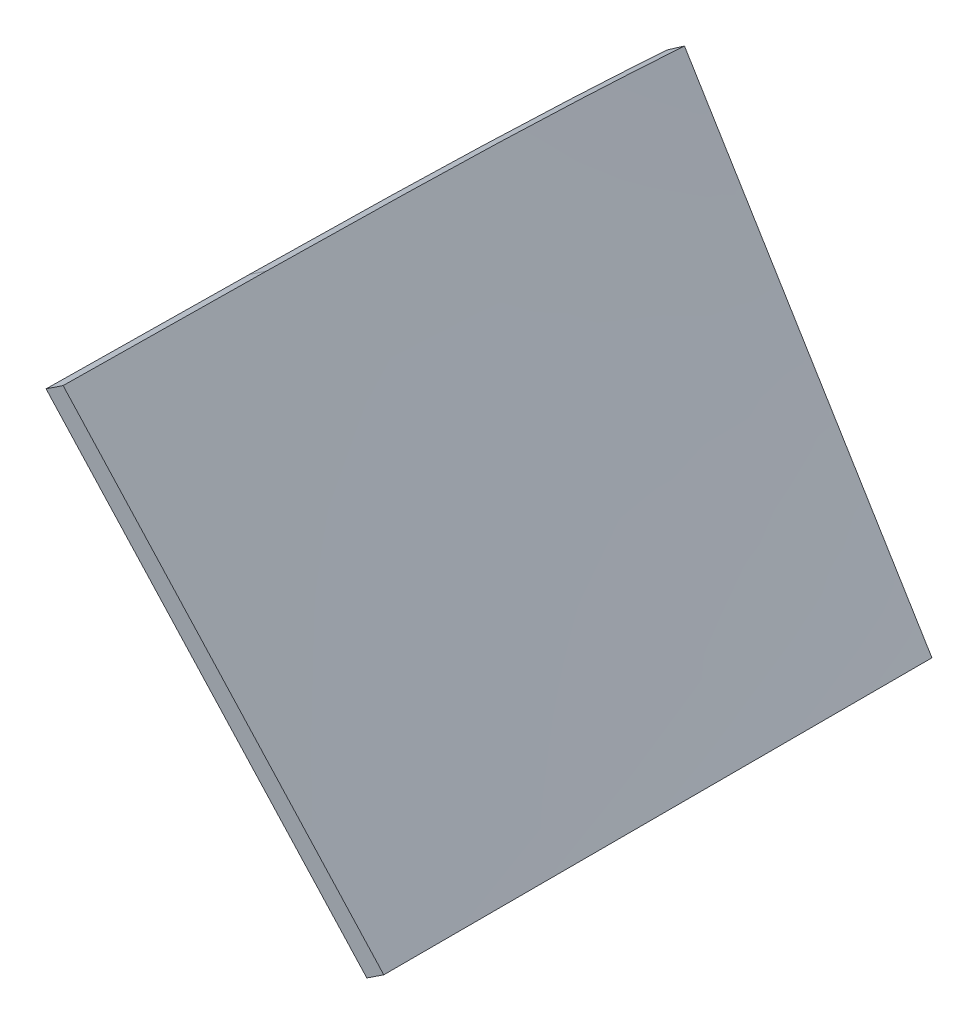
ISO-10303-21;
HEADER;
FILE_DESCRIPTION(('STEP AP214'),'2;1');
FILE_NAME('part.step','',(''),(''),'','','');
FILE_SCHEMA(('AUTOMOTIVE_DESIGN { 1 0 10303 214 1 1 1 1 }'));
ENDSEC;
DATA;
#1=APPLICATION_CONTEXT('core data for automotive mechanical design processes');
#2=APPLICATION_PROTOCOL_DEFINITION('international standard','automotive_design',2000,#1);
#3=PRODUCT_CONTEXT('',#1,'mechanical');
#4=PRODUCT('Part','Part','',(#3));
#5=PRODUCT_RELATED_PRODUCT_CATEGORY('part','',(#4));
#6=PRODUCT_DEFINITION_FORMATION('','',#4);
#7=PRODUCT_DEFINITION_CONTEXT('part definition',#1,'design');
#8=PRODUCT_DEFINITION('design','',#6,#7);
#9=PRODUCT_DEFINITION_SHAPE('','',#8);
#10=(LENGTH_UNIT() NAMED_UNIT(*) SI_UNIT(.MILLI.,.METRE.));
#11=(NAMED_UNIT(*) PLANE_ANGLE_UNIT() SI_UNIT($,.RADIAN.));
#12=(NAMED_UNIT(*) SI_UNIT($,.STERADIAN.) SOLID_ANGLE_UNIT());
#13=UNCERTAINTY_MEASURE_WITH_UNIT(LENGTH_MEASURE(1.E-05),#10,'distance_accuracy_value','');
#14=(GEOMETRIC_REPRESENTATION_CONTEXT(3) GLOBAL_UNCERTAINTY_ASSIGNED_CONTEXT((#13)) GLOBAL_UNIT_ASSIGNED_CONTEXT((#10,
#11,#12)) REPRESENTATION_CONTEXT('',''));
#15=CARTESIAN_POINT('',(0.,0.,0.));
#16=DIRECTION('',(0.,0.,1.));
#17=DIRECTION('',(1.,0.,0.));
#18=AXIS2_PLACEMENT_3D('',#15,#16,#17);
#19=CARTESIAN_POINT('',(-46.35271634638,40.53830935055,-44.7571495075));
#20=CARTESIAN_POINT('',(-41.96847746689,33.91507124039,-45.63504093705));
#21=CARTESIAN_POINT('',(-37.58423858741,27.29183313022,-46.5129323666));
#22=CARTESIAN_POINT('',(-33.19999970793,20.66859502006,-47.39082379616));
#23=CARTESIAN_POINT('',(-46.35271634575,40.53826691896,-44.76125233309));
#24=CARTESIAN_POINT('',(-41.96847746647,33.91504295266,-45.63889229337));
#25=CARTESIAN_POINT('',(-37.5842385872,27.29181898636,-46.51653225364));
#26=CARTESIAN_POINT('',(-33.19999970793,20.66859502006,-47.39417221391));
#27=CARTESIAN_POINT('',(-46.352715919,40.50971322981,-47.52195909475));
#28=CARTESIAN_POINT('',(-41.96847718226,33.89600716012,-48.23045546666));
#29=CARTESIAN_POINT('',(-37.58423844551,27.28230109043,-48.93895183858));
#30=CARTESIAN_POINT('',(-33.19999970877,20.66859502074,-49.64744821049));
#31=CARTESIAN_POINT('',(-46.35271621191,40.45281096228,-52.71864836174));
#32=CARTESIAN_POINT('',(-41.96847737712,33.85807231626,-53.19598283703));
#33=CARTESIAN_POINT('',(-37.58423854233,27.26333367024,-53.67331731233));
#34=CARTESIAN_POINT('',(-33.19999970754,20.66859502422,-54.15065178762));
#35=CARTESIAN_POINT('',(-46.3527145409,40.36959181985,-60.02635308157));
#36=CARTESIAN_POINT('',(-41.96847626328,33.80259288914,-60.31771356261));
#37=CARTESIAN_POINT('',(-37.58423798565,27.23559395843,-60.60907404365));
#38=CARTESIAN_POINT('',(-33.19999970803,20.66859502772,-60.90043452468));
#39=CARTESIAN_POINT('',(-46.35271084699,40.22175439641,-67.33566899911));
#40=CARTESIAN_POINT('',(-41.96847380062,33.70403460815,-67.44051798495));
#41=CARTESIAN_POINT('',(-37.58423675425,27.1863148199,-67.54536697079));
#42=CARTESIAN_POINT('',(-33.19999970789,20.66859503164,-67.65021595662));
#43=CARTESIAN_POINT('',(-46.35271116344,40.01548672161,-72.5251121711));
#44=CARTESIAN_POINT('',(-41.9684740116,33.56652282577,-72.40009805059));
#45=CARTESIAN_POINT('',(-37.58423685976,27.11755892992,-72.27508393008));
#46=CARTESIAN_POINT('',(-33.19999970792,20.66859503408,-72.15006980957));
#47=CARTESIAN_POINT('',(-46.35270771597,39.85315514337,-75.27684291461));
#48=CARTESIAN_POINT('',(-41.96847171328,33.458301774,-74.98456063754));
#49=CARTESIAN_POINT('',(-37.5842357106,27.06344840463,-74.69227836047));
#50=CARTESIAN_POINT('',(-33.19999970792,20.66859503525,-74.3999960834));
#51=B_SPLINE_SURFACE_WITH_KNOTS('',3,3,((#19,#20,#21,#22),(#23,#24,#25,#26),(#27,#28,#29,#30),
(#31,#32,#33,#34),(#35,#36,#37,#38),(#39,#40,#41,#42),(#43,#44,#45,#46),(#47,#48,#49,#50)),
.UNSPECIFIED.,.F.,.F.,.F.,(4,1,1,1,1,4),(4,4),(0.,0.0003719200707526,0.2502789763063,
0.5001860325419,0.7500930887774,1.),(0.02018564689678,0.9798143531073),.UNSPECIFIED.);
#52=DIRECTION('',(-0.565056265352985,0.824191961433354,-0.0376699839922836));
#53=VECTOR('',#52,1.);
#54=CARTESIAN_POINT('',(-39.745382843612,30.2157012175643,-74.8363499357355));
#55=LINE('',#54,#53);
#56=CARTESIAN_POINT('',(-33.1999997104452,20.6685950377552,-74.3999960838583));
#57=VERTEX_POINT('',#56);
#58=CARTESIAN_POINT('',(-46.2907657170478,39.7628069950391,-75.2727041596154));
#59=VERTEX_POINT('',#58);
#60=EDGE_CURVE('E142',#57,#59,#55,.T.);
#61=DIRECTION('',(7.08540403902029E-11,-5.6613843154E-10,1.));
#62=VECTOR('',#61,1.);
#63=CARTESIAN_POINT('',(-33.1999997079825,20.6685950276737,-60.764996397554));
#64=LINE('',#63,#62);
#65=CARTESIAN_POINT('',(-33.1999997093079,20.6685950228401,-47.3999975347496));
#66=VERTEX_POINT('',#65);
#67=EDGE_CURVE('E78',#57,#66,#64,.T.);
#68=CARTESIAN_POINT('',(-33.199999709662,20.668595022675,-47.3999975349335));
#69=CARTESIAN_POINT('',(-33.6003749246506,21.2734354423088,-47.3195482575815));
#70=CARTESIAN_POINT('',(-34.0007499598166,21.8782759808334,-47.2390989791535));
#71=CARTESIAN_POINT('',(-36.0026242813803,24.9024792384408,-46.8368525832584));
#72=CARTESIAN_POINT('',(-37.6041210049781,27.321843652474,-46.5150554545268));
#73=CARTESIAN_POINT('',(-40.3968011965886,31.5407247044943,-45.9539068482158));
#74=CARTESIAN_POINT('',(-41.5879856294462,33.3402407032827,-45.7145553667118));
#75=CARTESIAN_POINT('',(-43.9703524428452,36.9392740617689,-45.2358524216187));
#76=CARTESIAN_POINT('',(-45.1615348233867,38.7387914214669,-44.9965009580297));
#77=CARTESIAN_POINT('',(-46.3527163463802,40.5383093505504,-44.7571495074963));
#78=B_SPLINE_CURVE_WITH_KNOTS('',3,(#68,#69,#70,#71,#72,#73,#74,#75,#76,#77),.UNSPECIFIED.,.F.,
.F.,(4,2,2,2,4),(0.,2.18939237918589,10.9469618959338,17.4608091333248,23.9746563707246),.UNSPECIFIED.);
#79=CARTESIAN_POINT('',(-46.3527163463802,40.5383093505503,-44.7571495074993));
#80=VERTEX_POINT('',#79);
#81=EDGE_CURVE('E24',#66,#80,#78,.T.);
#82=CARTESIAN_POINT('',(-46.3452307460418,40.4178369783347,-54.7631379299025));
#83=CARTESIAN_POINT('',(-46.3456211186446,40.4226660094234,-54.3976782527337));
#84=CARTESIAN_POINT('',(-46.3460803433269,40.4275254063649,-54.0322190246597));
#85=CARTESIAN_POINT('',(-46.3469826606872,40.4371366392343,-53.3012996938548));
#86=CARTESIAN_POINT('',(-46.3474257533896,40.4418884753243,-52.9358395911259));
#87=CARTESIAN_POINT('',(-46.3481028616479,40.4506123986608,-52.2448297037328));
#88=CARTESIAN_POINT('',(-46.3483544264335,40.4546129665785,-51.9192803060328));
#89=CARTESIAN_POINT('',(-46.3486152959292,40.4622263897717,-51.2681768384454));
#90=CARTESIAN_POINT('',(-46.3486246006052,40.4658392449926,-50.9426227685574));
#91=CARTESIAN_POINT('',(-46.3485322056496,40.4728708630132,-50.2915124309111));
#92=CARTESIAN_POINT('',(-46.3484305059474,40.4762896256896,-49.9659561631516));
#93=CARTESIAN_POINT('',(-46.3482794251874,40.4831748680905,-49.3148442390717));
#94=CARTESIAN_POINT('',(-46.3482300441039,40.4866413477916,-48.989288582751));
#95=CARTESIAN_POINT('',(-46.3483734448369,40.4939048517459,-48.3381816649125));
#96=CARTESIAN_POINT('',(-46.3485662260943,40.4977018752359,-48.0126304033864));
#97=CARTESIAN_POINT('',(-46.3492201437808,40.5056635283119,-47.3615324782065));
#98=CARTESIAN_POINT('',(-46.3496812804235,40.5098281581906,-47.0359858145567));
#99=CARTESIAN_POINT('',(-46.3506557203851,40.5181970183352,-46.3848926985881));
#100=CARTESIAN_POINT('',(-46.3511690237671,40.522401248649,-46.0593462462701));
#101=CARTESIAN_POINT('',(-46.3520756782891,40.530587452471,-45.4082507730209));
#102=CARTESIAN_POINT('',(-46.3524690295589,40.5345694262199,-45.0827017520929));
#103=CARTESIAN_POINT('',(-46.3527163463802,40.5383093505503,-44.7571495075005));
#104=B_SPLINE_CURVE_WITH_KNOTS('',3,(#82,#83,#84,#85,#86,#87,#88,#89,#90,#91,#92,#93,#94,#95,
#96,#97,#98,#99,#100,#101,#102,#103),.UNSPECIFIED.,.F.,.F.,(4,2,2,2,2,2,2,2,2,2,4),(0.,
1.09647541821,2.19294918582856,3.16967116265738,4.14639327719797,5.12311601283067,
6.09983826776969,7.07655826760094,8.05327904493057,9.03000100417975,10.0067219060724),.UNSPECIFIED.);
#105=CARTESIAN_POINT('',(-46.34523074604,40.4178369783357,-54.7631379299026));
#106=VERTEX_POINT('',#105);
#107=EDGE_CURVE('E76',#106,#80,#104,.T.);
#108=CARTESIAN_POINT('',(-46.3452307460382,40.4178369783366,-54.7631379299026));
#109=CARTESIAN_POINT('',(-46.344871233383,40.4133740753418,-55.1010341326133));
#110=CARTESIAN_POINT('',(-46.3444817378596,40.4088004295629,-55.4389286441747));
#111=CARTESIAN_POINT('',(-46.3436481114375,40.3993879392983,-56.1147168428921));
#112=CARTESIAN_POINT('',(-46.3432039800633,40.394549092504,-56.4526105300154));
#113=CARTESIAN_POINT('',(-46.3408600412703,40.3695823912351,-58.1420941800658));
#114=CARTESIAN_POINT('',(-46.3385904796578,40.3471381757722,-59.4936530165683));
#115=CARTESIAN_POINT('',(-46.3348028399024,40.307283515031,-61.5208661729308));
#116=CARTESIAN_POINT('',(-46.3334764139609,40.2929672790461,-62.1965814695101));
#117=CARTESIAN_POINT('',(-46.3306902801319,40.2616344995744,-63.5479487885036));
#118=CARTESIAN_POINT('',(-46.3292305725384,40.2446179620436,-64.223600811054));
#119=CARTESIAN_POINT('',(-46.326024840861,40.2071375957596,-65.5748144323061));
#120=CARTESIAN_POINT('',(-46.3242788147672,40.1866737428078,-66.2503760303398));
#121=CARTESIAN_POINT('',(-46.3203277213981,40.1416754849692,-67.6013599954687));
#122=CARTESIAN_POINT('',(-46.3181226566496,40.117141102489,-68.27678236331));
#123=CARTESIAN_POINT('',(-46.3139476236654,40.0693739290101,-69.4791209607694));
#124=CARTESIAN_POINT('',(-46.3120323875596,40.0470387417904,-70.0060730321886));
#125=CARTESIAN_POINT('',(-46.3080859527196,39.9992724723857,-71.0598362730649));
#126=CARTESIAN_POINT('',(-46.3060547541459,39.9738413944909,-71.5866474427163));
#127=CARTESIAN_POINT('',(-46.3019018044209,39.9196267339011,-72.6401249516446));
#128=CARTESIAN_POINT('',(-46.2997800486051,39.8908429783809,-73.1667912820513));
#129=CARTESIAN_POINT('',(-46.2953934003465,39.8296312513973,-74.2199155046445));
#130=CARTESIAN_POINT('',(-46.2931285067346,39.7972032501622,-74.7463733950929));
#131=CARTESIAN_POINT('',(-46.2907657200124,39.7628069759444,-75.2727045490151));
#132=B_SPLINE_CURVE_WITH_KNOTS('',3,(#108,#109,#110,#111,#112,#113,#114,#115,#116,#117,#118,
#119,#120,#121,#122,#123,#124,#125,#126,#127,#128,#129,#130,#131),.UNSPECIFIED.,.F.,.F.,(4,2,2,
2,2,2,2,2,2,2,2,4),(0.,1.01377716603322,2.02756315808245,6.08278390316728,8.11038483788249,
10.1379813004965,12.1655919965462,14.1931915317764,15.7754695859303,17.3577454474947,
18.9401029090329,20.5224732986545),.UNSPECIFIED.);
#133=EDGE_CURVE('E87',#106,#59,#132,.T.);
#134=ORIENTED_EDGE('',*,*,#60,.F.);
#135=ORIENTED_EDGE('',*,*,#67,.T.);
#136=ORIENTED_EDGE('',*,*,#81,.T.);
#137=ORIENTED_EDGE('',*,*,#107,.F.);
#138=ORIENTED_EDGE('',*,*,#133,.T.);
#139=EDGE_LOOP('',(#134,#135,#136,#137,#138));
#140=FACE_BOUND('',#139,.T.);
#141=ADVANCED_FACE('F17',(#140),#51,.T.);
#142=CARTESIAN_POINT('',(-33.23903367021,20.64180625069,-74.66999523081));
#143=CARTESIAN_POINT('',(-32.93817576224,20.84828331048,-74.6699952307));
#144=CARTESIAN_POINT('',(-32.63731785428,21.05476037027,-74.66999523059));
#145=CARTESIAN_POINT('',(-32.33645994632,21.26123743007,-74.66999523049));
#146=CARTESIAN_POINT('',(-33.23903801549,20.64181258561,-74.57999551502));
#147=CARTESIAN_POINT('',(-32.93814661582,20.84824081802,-74.57999551491));
#148=CARTESIAN_POINT('',(-32.63725521615,21.05466905043,-74.5799955148));
#149=CARTESIAN_POINT('',(-32.33636381648,21.26109728285,-74.57999551469));
#150=CARTESIAN_POINT('',(-33.23925662179,20.64213136522,-69.98846708468));
#151=CARTESIAN_POINT('',(-32.93668029367,20.84610255409,-69.98846708457));
#152=CARTESIAN_POINT('',(-32.63410396555,21.05007374295,-69.98846708445));
#153=CARTESIAN_POINT('',(-32.33152763743,21.25404493182,-69.98846708434));
#154=CARTESIAN_POINT('',(-33.23938394824,20.64232473057,-60.89846785283));
#155=CARTESIAN_POINT('',(-32.93582623967,20.8448054986,-60.89846785272));
#156=CARTESIAN_POINT('',(-32.6322685311,21.04728626662,-60.8984678526));
#157=CARTESIAN_POINT('',(-32.32871082254,21.24976703465,-60.89846785249));
#158=CARTESIAN_POINT('',(-33.23944319341,20.64241286389,-51.71846834647));
#159=CARTESIAN_POINT('',(-32.93542884726,20.84421429629,-51.71846834635));
#160=CARTESIAN_POINT('',(-32.63141450112,21.0460157287,-51.71846834624));
#161=CARTESIAN_POINT('',(-32.32740015497,21.2478171611,-51.71846834612));
#162=CARTESIAN_POINT('',(-33.23947930787,20.64246744659,-47.03999755465));
#163=CARTESIAN_POINT('',(-32.9351866061,20.84384815748,-47.03999755453));
#164=CARTESIAN_POINT('',(-32.63089390433,21.04522886837,-47.03999755441));
#165=CARTESIAN_POINT('',(-32.32660120255,21.24660957926,-47.0399975543));
#166=CARTESIAN_POINT('',(-33.23948070755,20.64246956317,-46.85999756432));
#167=CARTESIAN_POINT('',(-32.93517721765,20.84383395952,-46.85999756421));
#168=CARTESIAN_POINT('',(-32.63087372775,21.04519835586,-46.85999756409));
#169=CARTESIAN_POINT('',(-32.32657023786,21.24656275221,-46.85999756398));
#170=B_SPLINE_SURFACE_WITH_KNOTS('',3,3,((#142,#143,#144,#145),(#146,#147,#148,#149),(#150,#151,
#152,#153),(#154,#155,#156,#157),(#158,#159,#160,#161),(#162,#163,#164,#165),(#166,#167,#168,
#169)),.UNSPECIFIED.,.F.,.F.,.F.,(4,1,1,1,4),(4,4),(1.735119587939E-08,0.009708725203181,
0.4953105606028,0.9805825240236,1.),(0.2234595600417,0.7765404393365),.UNSPECIFIED.);
#171=CARTESIAN_POINT('',(-32.3752272450634,21.2340492941419,-74.3999921229055));
#172=CARTESIAN_POINT('',(-32.3745023857276,21.2329934731899,-73.6701804038076));
#173=CARTESIAN_POINT('',(-32.3738604410586,21.2320562375851,-72.9403684729336));
#174=CARTESIAN_POINT('',(-32.3710049293247,21.2278775655191,-69.29130762419));
#175=CARTESIAN_POINT('',(-32.3698539981946,21.2261586485365,-66.3720561816685));
#176=CARTESIAN_POINT('',(-32.3687018681136,21.2244258482934,-62.1150709147366));
#177=CARTESIAN_POINT('',(-32.3684155924907,21.2239927539255,-60.777337020121));
#178=CARTESIAN_POINT('',(-32.3678865486693,21.2231953132975,-58.1018691994578));
#179=CARTESIAN_POINT('',(-32.3676437804696,21.2228309670356,-56.76413527341));
#180=CARTESIAN_POINT('',(-32.367190432851,21.2221508227852,-54.0886673793632));
#181=CARTESIAN_POINT('',(-32.366979853433,21.2218350247979,-52.7509334113641));
#182=CARTESIAN_POINT('',(-32.3665632001926,21.2212091209169,-50.0754654731639));
#183=CARTESIAN_POINT('',(-32.3663571263703,21.2208990150232,-48.7377315029627));
#184=CARTESIAN_POINT('',(-32.3661394637497,21.2205703270809,-47.3999975343849));
#185=B_SPLINE_CURVE_WITH_KNOTS('',3,(#171,#172,#173,#174,#175,#176,#177,#178,#179,#180,#181,
#182,#183,#184),.UNSPECIFIED.,.F.,.F.,(4,2,2,2,2,2,4),(0.,2.18943843421587,10.9471932295487,
14.9603953058982,18.9735972724603,22.986799342661,27.0000014132302),.UNSPECIFIED.);
#186=CARTESIAN_POINT('',(-32.3752256158428,21.2340504148553,-74.3999921228046));
#187=VERTEX_POINT('',#186);
#188=CARTESIAN_POINT('',(-32.3661375940465,21.2205706313074,-47.3999976210563));
#189=VERTEX_POINT('',#188);
#190=EDGE_CURVE('E174',#187,#189,#185,.T.);
#191=DIRECTION('',(-0.833860391670287,-0.551975404527661,-3.14866209467276E-10));
#192=VECTOR('',#191,1.);
#193=CARTESIAN_POINT('',(-32.7830649410598,20.9445857559192,-47.3999975344082));
#194=LINE('',#193,#192);
#195=EDGE_CURVE('E80',#189,#66,#194,.T.);
#196=DIRECTION('',(-0.82477735618273,-0.565457613541933,-3.96071078914936E-06));
#197=VECTOR('',#196,1.);
#198=CARTESIAN_POINT('',(-32.7876110333804,20.9513238472209,-74.3999941032725));
#199=LINE('',#198,#197);
#200=EDGE_CURVE('E195',#187,#57,#199,.T.);
#201=ORIENTED_EDGE('',*,*,#190,.T.);
#202=ORIENTED_EDGE('',*,*,#195,.T.);
#203=ORIENTED_EDGE('',*,*,#67,.F.);
#204=ORIENTED_EDGE('',*,*,#200,.F.);
#205=EDGE_LOOP('',(#201,#202,#203,#204));
#206=FACE_BOUND('',#205,.T.);
#207=ADVANCED_FACE('F153',(#206),#170,.F.);
#208=CARTESIAN_POINT('',(-33.10794960236,20.44376641107,-47.42642933321));
#209=CARTESIAN_POINT('',(-32.80367345161,20.64517918743,-47.42640375571));
#210=CARTESIAN_POINT('',(-32.49939730085,20.84659196379,-47.42637817822));
#211=CARTESIAN_POINT('',(-32.1951211501,21.04800474014,-47.42635260072));
#212=CARTESIAN_POINT('',(-33.15179191387,20.50999869409,-47.41761873154));
#213=CARTESIAN_POINT('',(-32.84751634873,20.71141221127,-47.41760169802));
#214=CARTESIAN_POINT('',(-32.54324078359,20.91282572845,-47.41758466451));
#215=CARTESIAN_POINT('',(-32.23896521845,21.11423924563,-47.41756763099));
#216=CARTESIAN_POINT('',(-34.65704466184,22.78397381843,-47.11512148001));
#217=CARTESIAN_POINT('',(-34.35278913159,22.98541270538,-47.11539716458));
#218=CARTESIAN_POINT('',(-34.04853360134,23.18685159234,-47.11567284915));
#219=CARTESIAN_POINT('',(-33.74427807109,23.38829047929,-47.11594853372));
#220=CARTESIAN_POINT('',(-37.62370846316,27.26569234714,-46.51894304225));
#221=CARTESIAN_POINT('',(-37.31948766216,27.46717689308,-46.5197535072));
#222=CARTESIAN_POINT('',(-37.01526686115,27.66866143902,-46.52056397216));
#223=CARTESIAN_POINT('',(-36.71104606015,27.87014598496,-46.52137443711));
#224=CARTESIAN_POINT('',(-42.00794175747,33.88892243997,-45.63790476808));
#225=CARTESIAN_POINT('',(-41.70376400501,34.09046878067,-45.63940068829));
#226=CARTESIAN_POINT('',(-41.39958625256,34.29201512138,-45.64089660851));
#227=CARTESIAN_POINT('',(-41.09540850011,34.49356146208,-45.64239252872));
#228=CARTESIAN_POINT('',(-44.97460685344,38.37064179563,-45.04174306465));
#229=CARTESIAN_POINT('',(-44.67045385719,38.57222743004,-45.04364478136));
#230=CARTESIAN_POINT('',(-44.36630086094,38.77381306446,-45.04554649807));
#231=CARTESIAN_POINT('',(-44.06214786469,38.97539869887,-45.04744821478));
#232=CARTESIAN_POINT('',(-46.47986078531,40.64461781985,-44.73925854721));
#233=CARTESIAN_POINT('',(-46.17571870445,40.84622189659,-44.74135483063));
#234=CARTESIAN_POINT('',(-45.87157662358,41.04782597334,-44.74345111404));
#235=CARTESIAN_POINT('',(-45.56743454271,41.24943005008,-44.74554739746));
#236=CARTESIAN_POINT('',(-46.52370313247,40.71085013056,-44.7304483199));
#237=CARTESIAN_POINT('',(-46.21956136812,40.91245474317,-44.73255026079));
#238=CARTESIAN_POINT('',(-45.91541960376,41.11405935578,-44.73465220168));
#239=CARTESIAN_POINT('',(-45.61127783941,41.31566396839,-44.73675414258));
#240=B_SPLINE_SURFACE_WITH_KNOTS('',3,3,((#208,#209,#210,#211),(#212,#213,#214,#215),(#216,#217,
#218,#219),(#220,#221,#222,#223),(#224,#225,#226,#227),(#228,#229,#230,#231),(#232,#233,#234,
#235),(#236,#237,#238,#239)),.UNSPECIFIED.,.F.,.F.,.F.,(4,1,1,1,1,4),(4,4),(0.0002070625314201,
0.0100069237743,0.336668974936,0.6633310260977,0.9899930772594,0.9997929386667),
(0.2234595601778,0.7765459834163),.UNSPECIFIED.);
#241=CARTESIAN_POINT('',(-32.3661386009627,21.2205690236845,-47.3999977078618));
#242=CARTESIAN_POINT('',(-32.766527257408,21.8254288263303,-47.3197613372516));
#243=CARTESIAN_POINT('',(-33.1669154978843,22.430288350753,-47.2395207934667));
#244=CARTESIAN_POINT('',(-35.1688546874308,25.4545846465211,-46.8382980277578));
#245=CARTESIAN_POINT('',(-36.7703995970201,27.8740174373554,-46.5172556656763));
#246=CARTESIAN_POINT('',(-39.5631575983197,32.0930089016989,-45.9573296712542));
#247=CARTESIAN_POINT('',(-40.7543731868123,33.8925691045453,-45.7184700143844));
#248=CARTESIAN_POINT('',(-43.1367989855807,37.4916865069768,-45.2407012462712));
#249=CARTESIAN_POINT('',(-44.3280091958564,39.2912437065618,-45.0017921350278));
#250=CARTESIAN_POINT('',(-45.5192171190151,41.0907997956548,-44.7628632584012));
#251=B_SPLINE_CURVE_WITH_KNOTS('',3,(#241,#242,#243,#244,#245,#246,#247,#248,#249,#250),
.UNSPECIFIED.,.F.,.F.,(4,2,2,2,4),(0.,2.18939237922101,10.946961897884,17.4608078380244,
23.9746537818239),.UNSPECIFIED.);
#252=CARTESIAN_POINT('',(-45.5192170215973,41.0907998602196,-44.7628632590621));
#253=VERTEX_POINT('',#252);
#254=EDGE_CURVE('E91',#189,#253,#251,.T.);
#255=DIRECTION('',(0.833499518728256,0.55249063820829,-0.0057137528789225));
#256=VECTOR('',#255,1.);
#257=CARTESIAN_POINT('',(-45.9359665790049,40.8145546749742,-44.7600063840002));
#258=LINE('',#257,#256);
#259=EDGE_CURVE('E84',#80,#253,#258,.T.);
#260=ORIENTED_EDGE('',*,*,#254,.T.);
#261=ORIENTED_EDGE('',*,*,#259,.F.);
#262=ORIENTED_EDGE('',*,*,#81,.F.);
#263=ORIENTED_EDGE('',*,*,#195,.F.);
#264=EDGE_LOOP('',(#260,#261,#262,#263));
#265=FACE_BOUND('',#264,.T.);
#266=ADVANCED_FACE('F89',(#265),#240,.F.);
#267=CARTESIAN_POINT('',(-46.38452705066,40.39019004961,-54.8628035281));
#268=CARTESIAN_POINT('',(-46.08084111942,40.59311209912,-54.86505741557));
#269=CARTESIAN_POINT('',(-45.77715518817,40.79603414862,-54.86731130305));
#270=CARTESIAN_POINT('',(-45.47346925692,40.99895619813,-54.86956519052));
#271=CARTESIAN_POINT('',(-46.38456156689,40.39062995509,-54.8294788631));
#272=CARTESIAN_POINT('',(-46.08087387574,40.59354899177,-54.83173012917));
#273=CARTESIAN_POINT('',(-45.77718618459,40.79646802845,-54.83398139523));
#274=CARTESIAN_POINT('',(-45.47349849344,40.99938706512,-54.8362326613));
#275=CARTESIAN_POINT('',(-46.38577176081,40.40580533184,-53.6807921533));
#276=CARTESIAN_POINT('',(-46.08202348619,40.6086277527,-53.68295393698));
#277=CARTESIAN_POINT('',(-45.77827521157,40.81145017356,-53.68511572067));
#278=CARTESIAN_POINT('',(-45.47452693694,41.01427259442,-53.68727750435));
#279=CARTESIAN_POINT('',(-46.38940462447,40.43620509225,-51.42966051079));
#280=CARTESIAN_POINT('',(-46.08554314016,40.63930128134,-51.43170714731));
#281=CARTESIAN_POINT('',(-45.78168165585,40.84239747042,-51.43375378382));
#282=CARTESIAN_POINT('',(-45.47782017154,41.0454936595,-51.43580042034));
#283=CARTESIAN_POINT('',(-46.38614652123,40.46805824262,-48.09094036146));
#284=CARTESIAN_POINT('',(-46.08214338269,40.67013903417,-48.09305152073));
#285=CARTESIAN_POINT('',(-45.77814024415,40.87221982572,-48.09516267999));
#286=CARTESIAN_POINT('',(-45.47413710561,41.07430061727,-48.09727383926));
#287=CARTESIAN_POINT('',(-46.39140866187,40.4998277253,-45.83748982703));
#288=CARTESIAN_POINT('',(-46.08731364717,40.70149165524,-45.83960637977));
#289=CARTESIAN_POINT('',(-45.78321863246,40.90315558518,-45.84172293251));
#290=CARTESIAN_POINT('',(-45.47912361775,41.10481951512,-45.84383948524));
#291=CARTESIAN_POINT('',(-46.39222511702,40.51291660331,-44.6901908943));
#292=CARTESIAN_POINT('',(-46.08808268642,40.71451357289,-44.69227389347));
#293=CARTESIAN_POINT('',(-45.78394025583,40.91611054248,-44.69435689265));
#294=CARTESIAN_POINT('',(-45.47979782524,41.11770751207,-44.69643989183));
#295=CARTESIAN_POINT('',(-46.39224718505,40.51329432186,-44.65684168537));
#296=CARTESIAN_POINT('',(-46.08810337561,40.71488946925,-44.65892367801));
#297=CARTESIAN_POINT('',(-45.78395956617,40.91648461664,-44.66100567065));
#298=CARTESIAN_POINT('',(-45.47981575674,41.11807976403,-44.66308766328));
#299=B_SPLINE_SURFACE_WITH_KNOTS('',3,3,((#267,#268,#269,#270),(#271,#272,#273,#274),(#275,#276,
#277,#278),(#279,#280,#281,#282),(#283,#284,#285,#286),(#287,#288,#289,#290),(#291,#292,#293,
#294),(#295,#296,#297,#298)),.UNSPECIFIED.,.F.,.F.,.F.,(4,1,1,1,1,4),(4,4),(0.01374604980327,
0.02324028140068,0.3410643959681,0.6588885105355,0.9767126251029,0.9862265582532),
(0.2234592200391,0.7765392675314),.UNSPECIFIED.);
#300=CARTESIAN_POINT('',(-45.5129604319491,40.9739256582741,-54.7692329700477));
#301=CARTESIAN_POINT('',(-45.5476383620662,40.9507552971494,-54.7689790105753));
#302=CARTESIAN_POINT('',(-45.5823162921377,40.9275849359574,-54.7687250510361));
#303=CARTESIAN_POINT('',(-45.6516721521898,40.8812442134386,-54.7682171318244));
#304=CARTESIAN_POINT('',(-45.6863500821705,40.8580738521117,-54.7679631721518));
#305=CARTESIAN_POINT('',(-45.755705942041,40.8117331293231,-54.7674552526732));
#306=CARTESIAN_POINT('',(-45.7903838719308,40.7885627678614,-54.7672012928671));
#307=CARTESIAN_POINT('',(-45.8597397316196,40.7422220448031,-54.7666933731217));
#308=CARTESIAN_POINT('',(-45.8944176614186,40.7190516832065,-54.7664394131822));
#309=CARTESIAN_POINT('',(-45.9637735209257,40.6727109598785,-54.7659314931699));
#310=CARTESIAN_POINT('',(-45.9984514506338,40.6495405981471,-54.765677533097));
#311=CARTESIAN_POINT('',(-46.0678073099591,40.6031998745494,-54.7651696128179));
#312=CARTESIAN_POINT('',(-46.1024852395764,40.5800295126831,-54.7649156526116));
#313=CARTESIAN_POINT('',(-46.1718410987201,40.5336887888157,-54.7644077320656));
#314=CARTESIAN_POINT('',(-46.2065190282465,40.5105184268145,-54.7641537717259));
#315=CARTESIAN_POINT('',(-46.2758748872085,40.4641777026774,-54.763645850913));
#316=CARTESIAN_POINT('',(-46.3105528166441,40.4410073405414,-54.7633918904398));
#317=CARTESIAN_POINT('',(-46.3452307460341,40.417836978338,-54.7631379299));
#318=B_SPLINE_CURVE_WITH_KNOTS('',3,(#300,#301,#302,#303,#304,#305,#306,#307,#308,#309,#310,
#311,#312,#313,#314,#315,#316,#317),.UNSPECIFIED.,.F.,.F.,(4,2,2,2,2,2,2,2,4),(0.,
0.125121543729852,0.250243087460312,0.375364631191365,0.500486174922962,0.625607718655145,
0.750729262387908,0.875850806121251,1.00097234985515),.UNSPECIFIED.);
#319=CARTESIAN_POINT('',(-45.51296066143,40.9739255049285,-54.7692329695346));
#320=VERTEX_POINT('',#319);
#321=EDGE_CURVE('E86',#320,#106,#318,.T.);
#322=CARTESIAN_POINT('',(-45.5192171190152,41.0907997956551,-44.7628632583963));
#323=CARTESIAN_POINT('',(-45.5191001659162,41.0887335246476,-44.9455975538133));
#324=CARTESIAN_POINT('',(-45.5189357290394,41.0865999677026,-45.1283310174108));
#325=CARTESIAN_POINT('',(-45.5185437707478,41.082244063297,-45.4937967625349));
#326=CARTESIAN_POINT('',(-45.5183162493543,41.0800217158662,-45.6765290440619));
#327=CARTESIAN_POINT('',(-45.5178300051566,41.0755340125252,-46.041992856191));
#328=CARTESIAN_POINT('',(-45.517571282382,41.0732686566558,-46.2247243867936));
#329=CARTESIAN_POINT('',(-45.517055739927,41.0687423462771,-46.5901875171923));
#330=CARTESIAN_POINT('',(-45.5167989202468,41.0664813917682,-46.7729191169882));
#331=CARTESIAN_POINT('',(-45.5161282465535,41.0602566249454,-47.2812146229604));
#332=CARTESIAN_POINT('',(-45.5157485564948,41.0563431568659,-47.6067792352478));
#333=CARTESIAN_POINT('',(-45.5153020274944,41.0489682513386,-48.2579137808531));
#334=CARTESIAN_POINT('',(-45.515235188518,41.0455068138407,-48.5834837141703));
#335=CARTESIAN_POINT('',(-45.5153209875931,41.0354992255448,-49.5601972388438));
#336=CARTESIAN_POINT('',(-45.5157599416848,41.0293297993344,-50.21134452185));
#337=CARTESIAN_POINT('',(-45.5158774573731,41.0190439371903,-51.1880541683332));
#338=CARTESIAN_POINT('',(-45.5158264771474,41.0154433684737,-51.5136217118874));
#339=CARTESIAN_POINT('',(-45.5154869735364,41.0077932088146,-52.1647515529519));
#340=CARTESIAN_POINT('',(-45.5151984499977,41.0037436175822,-52.4903138504586));
#341=CARTESIAN_POINT('',(-45.5145464981162,40.9954202545879,-53.1414360497837));
#342=CARTESIAN_POINT('',(-45.5141830696294,40.9911464823951,-53.4669959515962));
#343=CARTESIAN_POINT('',(-45.5135046762322,40.9825394454568,-54.1181146336038));
#344=CARTESIAN_POINT('',(-45.5131897112641,40.9782061807821,-54.4436734137998));
#345=CARTESIAN_POINT('',(-45.5129606614231,40.973925504904,-54.7692329707019));
#346=B_SPLINE_CURVE_WITH_KNOTS('',3,(#322,#323,#324,#325,#326,#327,#328,#329,#330,#331,#332,
#333,#334,#335,#336,#337,#338,#339,#340,#341,#342,#343,#344,#345),.UNSPECIFIED.,.F.,.F.,(4,2,2,
2,2,2,2,2,2,2,2,4),(0.,0.548237968619197,1.09647575220668,1.6447130144507,2.19295033688143,
3.16971510632031,4.14647976740979,6.10000918881065,7.0767711456851,8.05353373345676,
9.03029819878639,10.0070615012857),.UNSPECIFIED.);
#347=EDGE_CURVE('E185',#253,#320,#346,.T.);
#348=ORIENTED_EDGE('',*,*,#321,.T.);
#349=ORIENTED_EDGE('',*,*,#107,.T.);
#350=ORIENTED_EDGE('',*,*,#259,.T.);
#351=ORIENTED_EDGE('',*,*,#347,.T.);
#352=EDGE_LOOP('',(#348,#349,#350,#351));
#353=FACE_BOUND('',#352,.T.);
#354=ADVANCED_FACE('F82',(#353),#299,.T.);
#355=CARTESIAN_POINT('',(-46.3536387880476,40.4122200893842,-54.7630032404194));
#356=CARTESIAN_POINT('',(-46.3508361330651,40.4140927049461,-54.763023968813));
#357=CARTESIAN_POINT('',(-46.3480334780825,40.4159653205081,-54.7630446972065));
#358=CARTESIAN_POINT('',(-46.3452308231,40.41783793607,-54.7630654256));
#359=CARTESIAN_POINT('',(-46.06774023077,40.60324541745,-54.76511774179));
#360=CARTESIAN_POINT('',(-45.79024963844,40.78865289883,-54.76717005798));
#361=CARTESIAN_POINT('',(-45.51275904611,40.97406038021,-54.76922237417));
#362=CARTESIAN_POINT('',(-45.5099841401867,40.9759144550238,-54.7692428973319));
#363=CARTESIAN_POINT('',(-45.5072092342634,40.9777685298376,-54.7692634204938));
#364=CARTESIAN_POINT('',(-45.5044343283401,40.9796226046514,-54.7692839436557));
#365=CARTESIAN_POINT('',(-46.3514182418079,40.384657549804,-56.8492596752219));
#366=CARTESIAN_POINT('',(-46.3486166008986,40.386531670636,-56.8492818885213));
#367=CARTESIAN_POINT('',(-46.3458149599893,40.388405791468,-56.8493041018206));
#368=CARTESIAN_POINT('',(-46.34301331908,40.3902799123,-56.84932631512));
#369=CARTESIAN_POINT('',(-46.06562313004,40.57583643032,-56.85152565169));
#370=CARTESIAN_POINT('',(-45.788232941,40.76139294834,-56.85372498827));
#371=CARTESIAN_POINT('',(-45.51084275196,40.94694946637,-56.85592432484));
#372=CARTESIAN_POINT('',(-45.5080688500696,40.9488050315503,-56.8559463182057));
#373=CARTESIAN_POINT('',(-45.5052949481792,40.9506605967306,-56.8559683115714));
#374=CARTESIAN_POINT('',(-45.5025210462888,40.9525161619109,-56.8559903049371));
#375=CARTESIAN_POINT('',(-46.3449684420227,40.3247302449163,-60.7500542061028));
#376=CARTESIAN_POINT('',(-46.3421691915085,40.3265948157775,-60.7500838156286));
#377=CARTESIAN_POINT('',(-46.3393699409942,40.3284593866388,-60.7501134251543));
#378=CARTESIAN_POINT('',(-46.33657069048,40.3303239575,-60.75014303468));
#379=CARTESIAN_POINT('',(-46.05941717422,40.51493493386,-60.75307467089));
#380=CARTESIAN_POINT('',(-45.78226365796,40.69954591023,-60.7560063071));
#381=CARTESIAN_POINT('',(-45.5051101417,40.8841568866,-60.75893794332));
#382=CARTESIAN_POINT('',(-45.5023386065374,40.8860029963637,-60.7589672596822));
#383=CARTESIAN_POINT('',(-45.4995670713748,40.8878491061274,-60.7589965760444));
#384=CARTESIAN_POINT('',(-45.4967955362122,40.8896952158911,-60.7590258924066));
#385=CARTESIAN_POINT('',(-46.3342039508537,40.1965234196026,-66.1278431888221));
#386=CARTESIAN_POINT('',(-46.3314096153091,40.1984230444884,-66.127894027028));
#387=CARTESIAN_POINT('',(-46.3286152797646,40.2003226693742,-66.127944865234));
#388=CARTESIAN_POINT('',(-46.32582094422,40.20222229426,-66.12799570344));
#389=CARTESIAN_POINT('',(-46.04915405862,40.39030396612,-66.13302918918));
#390=CARTESIAN_POINT('',(-45.77248717302,40.57838563798,-66.13806267493));
#391=CARTESIAN_POINT('',(-45.49582028742,40.76646730984,-66.14309616067));
#392=CARTESIAN_POINT('',(-45.493053618564,40.7683481265586,-66.1431464955274));
#393=CARTESIAN_POINT('',(-45.490286949708,40.7702289432772,-66.1431968303848));
#394=CARTESIAN_POINT('',(-45.487520280852,40.7721097599958,-66.1432471652422));
#395=CARTESIAN_POINT('',(-46.3171441178411,40.0103064039234,-70.9812650173733));
#396=CARTESIAN_POINT('',(-46.3143568125008,40.0122029971989,-70.9813431144388));
#397=CARTESIAN_POINT('',(-46.3115695071604,40.0140995904745,-70.9814212115044));
#398=CARTESIAN_POINT('',(-46.30878220182,40.01599618375,-70.98149930857));
#399=CARTESIAN_POINT('',(-46.03281137604,40.20377769618,-70.9892316913));
#400=CARTESIAN_POINT('',(-45.75684055026,40.39155920861,-70.99696407402));
#401=CARTESIAN_POINT('',(-45.48086972448,40.57934072104,-71.00469645675));
#402=CARTESIAN_POINT('',(-45.4781100162222,40.5812185361643,-71.0047737805773));
#403=CARTESIAN_POINT('',(-45.4753503079644,40.5830963512886,-71.0048511044046));
#404=CARTESIAN_POINT('',(-45.4725905997066,40.5849741664129,-71.0049284282319));
#405=CARTESIAN_POINT('',(-46.3053018021952,39.8467516439059,-73.9012058094843));
#406=CARTESIAN_POINT('',(-46.3025204038335,39.8486474042906,-73.9013058257995));
#407=CARTESIAN_POINT('',(-46.2997390054717,39.8505431646753,-73.9014058421148));
#408=CARTESIAN_POINT('',(-46.29695760711,39.85243892506,-73.90150585843));
#409=CARTESIAN_POINT('',(-46.0215716307,40.04013797305,-73.9114084639));
#410=CARTESIAN_POINT('',(-45.74618565428,40.22783702104,-73.92131106936));
#411=CARTESIAN_POINT('',(-45.47079967787,40.41553606902,-73.93121367483));
#412=CARTESIAN_POINT('',(-45.4680458181059,40.4174130594998,-73.9313127008847));
#413=CARTESIAN_POINT('',(-45.4652919583418,40.4192900499796,-73.9314117269394));
#414=CARTESIAN_POINT('',(-45.4625380985777,40.4211670404594,-73.9315107529941));
#415=CARTESIAN_POINT('',(-46.2991005313626,39.7571079216108,-75.2723713035808));
#416=CARTESIAN_POINT('',(-46.2963222584384,39.7590075705738,-75.2724829332905));
#417=CARTESIAN_POINT('',(-46.2935439855142,39.7609072195369,-75.2725945630003));
#418=CARTESIAN_POINT('',(-46.29076571259,39.7628068685,-75.27270619271));
#419=CARTESIAN_POINT('',(-46.01568918544,39.95089092425,-75.28375863922));
#420=CARTESIAN_POINT('',(-45.74061265829,40.13897497999,-75.29481108572));
#421=CARTESIAN_POINT('',(-45.46553613115,40.32705903574,-75.30586353223));
#422=CARTESIAN_POINT('',(-45.4627853658786,40.3289398762975,-75.3059740566951));
#423=CARTESIAN_POINT('',(-45.4600346006072,40.330820716855,-75.3060845811602));
#424=CARTESIAN_POINT('',(-45.4572838353358,40.3327015574125,-75.3061951056253));
#425=CARTESIAN_POINT('',(-46.2988524799205,39.7535221639174,-75.3272180579715));
#426=CARTESIAN_POINT('',(-46.2960743320141,39.755421968424,-75.3273301522182));
#427=CARTESIAN_POINT('',(-46.2932961841077,39.7573217729305,-75.3274422464649));
#428=CARTESIAN_POINT('',(-46.2905180362013,39.7592215774371,-75.3275543407116));
#429=CARTESIAN_POINT('',(-46.015453887052,39.9473210335353,-75.3386527809761));
#430=CARTESIAN_POINT('',(-45.7403897379032,40.1354204896231,-75.3497512212306));
#431=CARTESIAN_POINT('',(-45.4653255887644,40.3235199457217,-75.3608496614951));
#432=CARTESIAN_POINT('',(-45.462574947273,40.3254009402827,-75.3609606458977));
#433=CARTESIAN_POINT('',(-45.4598243057816,40.3272819348437,-75.3610716303003));
#434=CARTESIAN_POINT('',(-45.4570736642902,40.3291629294047,-75.361182614703));
#435=CARTESIAN_POINT('',(-46.2986044284783,39.749936406224,-75.3820648123624));
#436=CARTESIAN_POINT('',(-46.2958264055897,39.7518363662741,-75.382177371146));
#437=CARTESIAN_POINT('',(-46.2930483827011,39.7537363263242,-75.3822899299296));
#438=CARTESIAN_POINT('',(-46.2902703598125,39.7556362863743,-75.3824024887131));
#439=CARTESIAN_POINT('',(-46.0152185886641,39.9437511428207,-75.3935469227321));
#440=CARTESIAN_POINT('',(-45.7401668175164,40.1318659992563,-75.4046913567411));
#441=CARTESIAN_POINT('',(-45.4651150463788,40.3199808557035,-75.4158357907601));
#442=CARTESIAN_POINT('',(-45.4623645286674,40.321862004268,-75.4159472351003));
#443=CARTESIAN_POINT('',(-45.4596140109561,40.3237431528324,-75.4160586794405));
#444=CARTESIAN_POINT('',(-45.4568634932447,40.3256243013969,-75.4161701237807));
#445=CARTESIAN_POINT('',(-46.2983563770361,39.7463506485305,-75.4369115667532));
#446=CARTESIAN_POINT('',(-46.2955784791654,39.7482507641242,-75.4370245900737));
#447=CARTESIAN_POINT('',(-46.2928005812946,39.7501508797178,-75.4371376133942));
#448=CARTESIAN_POINT('',(-46.2900226834238,39.7520509953114,-75.4372506367147));
#449=CARTESIAN_POINT('',(-46.0149832902761,39.940181252106,-75.4484410644882));
#450=CARTESIAN_POINT('',(-45.7399438971297,40.1283115088894,-75.4596314922517));
#451=CARTESIAN_POINT('',(-45.4649045039932,40.3164417656852,-75.4708219200252));
#452=CARTESIAN_POINT('',(-45.4621541100618,40.3183230682532,-75.4709338243029));
#453=CARTESIAN_POINT('',(-45.4594037161305,40.3202043708211,-75.4710457285806));
#454=CARTESIAN_POINT('',(-45.4566533221991,40.3220856733891,-75.4711576328584));
#455=B_SPLINE_SURFACE_WITH_KNOTS('',3,3,((#355,#356,#357,#358,#359,#360,#361,#362,#363,#364),
(#365,#366,#367,#368,#369,#370,#371,#372,#373,#374),(#375,#376,#377,#378,#379,#380,#381,#382,
#383,#384),(#385,#386,#387,#388,#389,#390,#391,#392,#393,#394),(#395,#396,#397,#398,#399,#400,
#401,#402,#403,#404),(#405,#406,#407,#408,#409,#410,#411,#412,#413,#414),(#415,#416,#417,#418,
#419,#420,#421,#422,#423,#424),(#425,#426,#427,#428,#429,#430,#431,#432,#433,#434),(#435,#436,
#437,#438,#439,#440,#441,#442,#443,#444),(#445,#446,#447,#448,#449,#450,#451,#452,#453,#454)),
.UNSPECIFIED.,.F.,.F.,.F.,(4,1,1,1,3,4),(4,3,3,4),(-1.193478442874E-13,0.2500020985886,
0.5000013010484,0.7500005035082,0.9999998531438,1.00999985167524),(0.242250376683658,
0.2473540456154,0.7526678012334,0.75772093878958),.UNSPECIFIED.);
#456=CARTESIAN_POINT('',(-45.5129606614292,40.9739255049132,-54.769232970702));
#457=CARTESIAN_POINT('',(-45.5127279971231,40.9695291316791,-55.1037840877875));
#458=CARTESIAN_POINT('',(-45.5124514567452,40.9649881254999,-55.4383332608059));
#459=CARTESIAN_POINT('',(-45.5118200105874,40.9556043067093,-56.1074300452182));
#460=CARTESIAN_POINT('',(-45.5114651041642,40.9507614916208,-56.4419776565768));
#461=CARTESIAN_POINT('',(-45.510296913284,40.935761507566,-57.4456218284499));
#462=CARTESIAN_POINT('',(-45.5093801635515,40.9251329099447,-58.1147112978762));
#463=CARTESIAN_POINT('',(-45.5073145352565,40.9025820585985,-59.4528691187857));
#464=CARTESIAN_POINT('',(-45.5061656563114,40.8906598027416,-60.1219374702322));
#465=CARTESIAN_POINT('',(-45.5038421735136,40.8653956475191,-61.4600434852258));
#466=CARTESIAN_POINT('',(-45.5026675698203,40.8520537569528,-62.1290811489373));
#467=CARTESIAN_POINT('',(-45.5002809636398,40.8229514538275,-63.4671035356126));
#468=CARTESIAN_POINT('',(-45.4990689612679,40.8071910487255,-64.1360882587333));
#469=CARTESIAN_POINT('',(-45.4970784750243,40.7809332801422,-65.1395029789228));
#470=CARTESIAN_POINT('',(-45.4963862250942,40.7717443973236,-65.4739673377773));
#471=CARTESIAN_POINT('',(-45.4948942745497,40.7523289341377,-66.142865711333));
#472=CARTESIAN_POINT('',(-45.4940945739704,40.7421023541087,-66.4772997260442));
#473=CARTESIAN_POINT('',(-45.4915495245781,40.709764885319,-67.4805439396391));
#474=CARTESIAN_POINT('',(-45.4896582197424,40.6859961581706,-68.1493005896343));
#475=CARTESIAN_POINT('',(-45.4844310996537,40.6175699359304,-69.8998744054057));
#476=CARTESIAN_POINT('',(-45.4809249177859,40.5690810877196,-70.9815459239848));
#477=CARTESIAN_POINT('',(-45.4754637270429,40.4861640104656,-72.6035586045169));
#478=CARTESIAN_POINT('',(-45.47360961545,40.4568265975289,-73.1441641149656));
#479=CARTESIAN_POINT('',(-45.4697815558873,40.3945868176333,-74.2251712133228));
#480=CARTESIAN_POINT('',(-45.467807607487,40.3616844378706,-74.7655728004919));
#481=CARTESIAN_POINT('',(-45.4657474669591,40.3269144264518,-75.3058566538778));
#482=B_SPLINE_CURVE_WITH_KNOTS('',3,(#456,#457,#458,#459,#460,#461,#462,#463,#464,#465,#466,
#467,#468,#469,#470,#471,#472,#473,#474,#475,#476,#477,#478,#479,#480,#481),.UNSPECIFIED.,.F.,
.F.,(4,2,2,2,2,2,2,2,2,2,2,2,4),(0.,1.00374018498752,2.00748860884481,4.01501074534135,
6.02253619023175,8.03004919244339,10.0375560050317,11.0413284977393,12.045100663208,
14.0526321452339,17.300831827435,18.9250341681167,20.549242342497),.UNSPECIFIED.);
#483=CARTESIAN_POINT('',(-45.4657474691064,40.3269143820183,-75.3058574634122));
#484=VERTEX_POINT('',#483);
#485=EDGE_CURVE('E36',#320,#484,#482,.T.);
#486=DIRECTION('',(0.825030037630187,0.564115447557022,-0.0331541676938559));
#487=VECTOR('',#486,1.);
#488=CARTESIAN_POINT('',(-45.8782506951896,40.0448647379556,-75.2892808542955));
#489=LINE('',#488,#487);
#490=EDGE_CURVE('E44',#59,#484,#489,.T.);
#491=ORIENTED_EDGE('',*,*,#485,.T.);
#492=ORIENTED_EDGE('',*,*,#490,.F.);
#493=ORIENTED_EDGE('',*,*,#133,.F.);
#494=ORIENTED_EDGE('',*,*,#321,.F.);
#495=EDGE_LOOP('',(#491,#492,#493,#494));
#496=FACE_BOUND('',#495,.T.);
#497=ADVANCED_FACE('F114',(#496),#455,.F.);
#498=CARTESIAN_POINT('',(-33.10813860327,20.45088250057,-74.39128846865));
#499=CARTESIAN_POINT('',(-32.80718479254,20.65721966516,-74.3911385399));
#500=CARTESIAN_POINT('',(-32.50623098181,20.86355682975,-74.39098861115));
#501=CARTESIAN_POINT('',(-32.20527717108,21.06989399434,-74.3908386824));
#502=CARTESIAN_POINT('',(-33.1517745789,20.51452999944,-74.3941910555));
#503=CARTESIAN_POINT('',(-32.85081969599,20.72086563197,-74.3940907284));
#504=CARTESIAN_POINT('',(-32.54986481309,20.92720126451,-74.39399040129));
#505=CARTESIAN_POINT('',(-32.24890993018,21.13353689705,-74.39389007418));
#506=CARTESIAN_POINT('',(-37.55901300726,26.9429347306,-74.68735406774));
#507=CARTESIAN_POINT('',(-37.25795083476,27.14911543602,-74.69225267434));
#508=CARTESIAN_POINT('',(-36.95688866226,27.35529614143,-74.69715128093));
#509=CARTESIAN_POINT('',(-36.65582648977,27.56147684685,-74.70204988752));
#510=CARTESIAN_POINT('',(-42.00987435444,33.43498956198,-74.98356246313));
#511=CARTESIAN_POINT('',(-41.70880511372,33.64099471628,-74.99240903311));
#512=CARTESIAN_POINT('',(-41.407735873,33.84699987058,-75.0012556031));
#513=CARTESIAN_POINT('',(-41.10666663228,34.05300502488,-75.01010217309));
#514=CARTESIAN_POINT('',(-46.41709629578,39.86339580492,-75.27694370464));
#515=CARTESIAN_POINT('',(-46.11604749769,40.06923533816,-75.28910722962));
#516=CARTESIAN_POINT('',(-45.8149986996,40.2750748714,-75.3012707546));
#517=CARTESIAN_POINT('',(-45.5139499015,40.48091440464,-75.31343427958));
#518=CARTESIAN_POINT('',(-46.46073219094,39.92704344199,-75.27984847919));
#519=CARTESIAN_POINT('',(-46.15968359787,40.13288133624,-75.29204478776));
#520=CARTESIAN_POINT('',(-45.8586350048,40.3387192305,-75.30424109633));
#521=CARTESIAN_POINT('',(-45.55758641173,40.54455712476,-75.31643740489));
#522=B_SPLINE_SURFACE_WITH_KNOTS('',3,3,((#498,#499,#500,#501),(#502,#503,#504,#505),(#506,#507,
#508,#509),(#510,#511,#512,#513),(#514,#515,#516,#517),(#518,#519,#520,#521)),.UNSPECIFIED.,.F.,
.F.,.F.,(4,1,1,4),(4,4),(0.0005497688245414,0.0102424830805,0.9795150236475,0.9892077568373),
(0.2234595431457,0.776540380632),.UNSPECIFIED.);
#523=CARTESIAN_POINT('',(-45.4657474743505,40.3269143896671,-75.3058574637726));
#524=CARTESIAN_POINT('',(-45.0533462368754,39.7254051655212,-75.277511088389));
#525=CARTESIAN_POINT('',(-44.6409444681129,39.1238969695659,-75.2491505972124));
#526=CARTESIAN_POINT('',(-42.5789335081683,36.1163610213746,-75.1072718669924));
#527=CARTESIAN_POINT('',(-40.9293179885937,33.71034839307,-74.9935248063126));
#528=CARTESIAN_POINT('',(-38.4548950878645,30.1013517389383,-74.8224287584941));
#529=CARTESIAN_POINT('',(-37.6300875184856,28.8983565705414,-74.7653174998308));
#530=CARTESIAN_POINT('',(-35.3285882659236,25.5415842785657,-74.6057102257855));
#531=CARTESIAN_POINT('',(-33.8519003325684,23.3878138562581,-74.5030192134965));
#532=CARTESIAN_POINT('',(-32.3752272469997,21.2340492969662,-74.3999921228194));
#533=B_SPLINE_CURVE_WITH_KNOTS('',3,(#523,#524,#525,#526,#527,#528,#529,#530,#531,#532),
.UNSPECIFIED.,.F.,.F.,(4,2,2,2,4),(0.,2.18957183264358,10.9478591986204,15.3270028700125,
23.1672144004733),.UNSPECIFIED.);
#534=EDGE_CURVE('E11',#484,#187,#533,.T.);
#535=ORIENTED_EDGE('',*,*,#200,.T.);
#536=ORIENTED_EDGE('',*,*,#60,.T.);
#537=ORIENTED_EDGE('',*,*,#490,.T.);
#538=ORIENTED_EDGE('',*,*,#534,.T.);
#539=EDGE_LOOP('',(#535,#536,#537,#538));
#540=FACE_BOUND('',#539,.T.);
#541=ADVANCED_FACE('F109',(#540),#522,.T.);
#542=CARTESIAN_POINT('',(-45.78224436476,41.49136620263,-44.40492821937));
#543=CARTESIAN_POINT('',(-41.22250734594,34.60192257901,-45.3355414506));
#544=CARTESIAN_POINT('',(-36.66277032712,27.71247895538,-46.26615468182));
#545=CARTESIAN_POINT('',(-32.10303330829,20.82303533176,-47.19676791305));
#546=CARTESIAN_POINT('',(-45.78288298131,41.43265932909,-50.06769075271));
#547=CARTESIAN_POINT('',(-41.22318309459,34.56355252541,-50.63170334779));
#548=CARTESIAN_POINT('',(-36.66348320787,27.69444572172,-51.19571594287));
#549=CARTESIAN_POINT('',(-32.10378332115,20.82533891803,-51.75972853795));
#550=CARTESIAN_POINT('',(-45.78389584639,41.3386355377,-60.00774109385));
#551=CARTESIAN_POINT('',(-41.22427218679,34.50210976035,-60.30951568997));
#552=CARTESIAN_POINT('',(-36.6646485272,27.66558398301,-60.61129028608));
#553=CARTESIAN_POINT('',(-32.1050248676,20.82905820566,-60.9130648822));
#554=CARTESIAN_POINT('',(-45.78708713279,41.12374998953,-69.96846330671));
#555=CARTESIAN_POINT('',(-41.22730473263,34.36166309928,-70.00097017334));
#556=CARTESIAN_POINT('',(-36.66752233248,27.59957620903,-70.03347703997));
#557=CARTESIAN_POINT('',(-32.10773993232,20.83748931878,-70.06598390659));
#558=CARTESIAN_POINT('',(-45.79094492644,40.78267137063,-75.63464071639));
#559=CARTESIAN_POINT('',(-41.23143956751,34.13881897316,-75.29944497166));
#560=CARTESIAN_POINT('',(-36.67193420859,27.49496657569,-74.96424922693));
#561=CARTESIAN_POINT('',(-32.11242884967,20.85111417822,-74.62905348219));
#562=B_SPLINE_SURFACE_WITH_KNOTS('',3,3,((#542,#543,#544,#545),(#546,#547,#548,#549),(#550,#551,
#552,#553),(#554,#555,#556,#557),(#558,#559,#560,#561)),.UNSPECIFIED.,.F.,.F.,.F.,(4,1,4),(4,4),
(3.963144296395E-05,0.4999905941368,0.9999687749346),(0.001003071609135,1.009192676342),.UNSPECIFIED.);
#563=ORIENTED_EDGE('',*,*,#485,.F.);
#564=ORIENTED_EDGE('',*,*,#347,.F.);
#565=ORIENTED_EDGE('',*,*,#254,.F.);
#566=ORIENTED_EDGE('',*,*,#190,.F.);
#567=ORIENTED_EDGE('',*,*,#534,.F.);
#568=EDGE_LOOP('',(#563,#564,#565,#566,#567));
#569=FACE_BOUND('',#568,.T.);
#570=ADVANCED_FACE('F19',(#569),#562,.F.);
#571=CLOSED_SHELL('',(#141,#207,#266,#354,#497,#541,#570));
#572=MANIFOLD_SOLID_BREP('B1',#571);
#573=ADVANCED_BREP_SHAPE_REPRESENTATION('',(#18,#572),#14);
#574=SHAPE_DEFINITION_REPRESENTATION(#9,#573);
ENDSEC;
END-ISO-10303-21;
